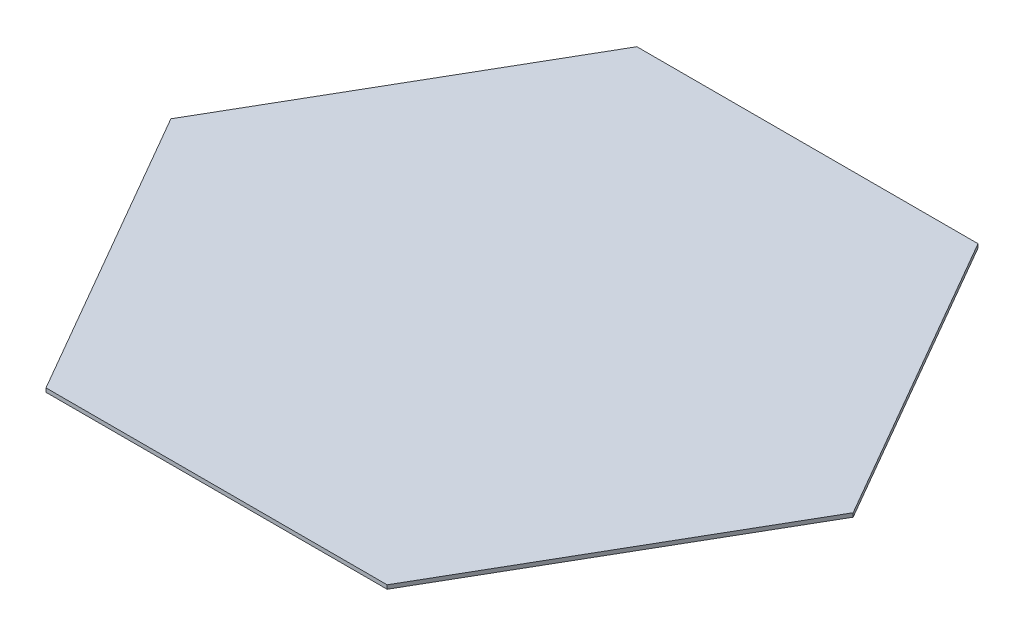
ISO-10303-21;
HEADER;
FILE_DESCRIPTION(('STEP AP214'),'2;1');
FILE_NAME('part.step','',(''),(''),'','','');
FILE_SCHEMA(('AUTOMOTIVE_DESIGN { 1 0 10303 214 1 1 1 1 }'));
ENDSEC;
DATA;
#1=APPLICATION_CONTEXT('core data for automotive mechanical design processes');
#2=APPLICATION_PROTOCOL_DEFINITION('international standard','automotive_design',2000,#1);
#3=PRODUCT_CONTEXT('',#1,'mechanical');
#4=PRODUCT('Part','Part','',(#3));
#5=PRODUCT_RELATED_PRODUCT_CATEGORY('part','',(#4));
#6=PRODUCT_DEFINITION_FORMATION('','',#4);
#7=PRODUCT_DEFINITION_CONTEXT('part definition',#1,'design');
#8=PRODUCT_DEFINITION('design','',#6,#7);
#9=PRODUCT_DEFINITION_SHAPE('','',#8);
#10=(LENGTH_UNIT() NAMED_UNIT(*) SI_UNIT(.MILLI.,.METRE.));
#11=(NAMED_UNIT(*) PLANE_ANGLE_UNIT() SI_UNIT($,.RADIAN.));
#12=(NAMED_UNIT(*) SI_UNIT($,.STERADIAN.) SOLID_ANGLE_UNIT());
#13=UNCERTAINTY_MEASURE_WITH_UNIT(LENGTH_MEASURE(1.E-05),#10,'distance_accuracy_value','');
#14=(GEOMETRIC_REPRESENTATION_CONTEXT(3) GLOBAL_UNCERTAINTY_ASSIGNED_CONTEXT((#13)) GLOBAL_UNIT_ASSIGNED_CONTEXT((#10,
#11,#12)) REPRESENTATION_CONTEXT('',''));
#15=CARTESIAN_POINT('',(0.,0.,0.));
#16=DIRECTION('',(0.,0.,1.));
#17=DIRECTION('',(1.,0.,0.));
#18=AXIS2_PLACEMENT_3D('',#15,#16,#17);
#19=CARTESIAN_POINT('',(440.,5.,0.));
#20=DIRECTION('',(-0.866025403784439,0.,0.5));
#21=DIRECTION('',(0.5,0.,0.866025403784439));
#22=AXIS2_PLACEMENT_3D('',#19,#20,#21);
#23=PLANE('',#22);
#24=DIRECTION('',(-0.5,0.,-0.866025403784439));
#25=VECTOR('',#24,1.);
#26=CARTESIAN_POINT('',(440.,0.,0.));
#27=LINE('',#26,#25);
#28=CARTESIAN_POINT('',(440.,0.,0.));
#29=VERTEX_POINT('',#28);
#30=CARTESIAN_POINT('',(220.,0.,-381.051177665153));
#31=VERTEX_POINT('',#30);
#32=EDGE_CURVE('E129',#29,#31,#27,.T.);
#33=ORIENTED_EDGE('',*,*,#32,.T.);
#34=DIRECTION('',(0.,-1.,0.));
#35=VECTOR('',#34,1.);
#36=CARTESIAN_POINT('',(220.,5.,-381.051177665153));
#37=LINE('',#36,#35);
#38=CARTESIAN_POINT('',(220.,5.,-381.051177665153));
#39=VERTEX_POINT('',#38);
#40=EDGE_CURVE('E11',#39,#31,#37,.T.);
#41=ORIENTED_EDGE('',*,*,#40,.F.);
#42=DIRECTION('',(-0.5,0.,-0.866025403784439));
#43=VECTOR('',#42,1.);
#44=CARTESIAN_POINT('',(440.,5.,0.));
#45=LINE('',#44,#43);
#46=CARTESIAN_POINT('',(440.,5.,0.));
#47=VERTEX_POINT('',#46);
#48=EDGE_CURVE('E145',#47,#39,#45,.T.);
#49=ORIENTED_EDGE('',*,*,#48,.F.);
#50=DIRECTION('',(0.,-1.,0.));
#51=VECTOR('',#50,1.);
#52=CARTESIAN_POINT('',(440.,5.,0.));
#53=LINE('',#52,#51);
#54=EDGE_CURVE('E125',#47,#29,#53,.T.);
#55=ORIENTED_EDGE('',*,*,#54,.T.);
#56=EDGE_LOOP('',(#33,#41,#49,#55));
#57=FACE_BOUND('',#56,.T.);
#58=ADVANCED_FACE('F39',(#57),#23,.F.);
#59=CARTESIAN_POINT('',(220.,5.,-381.051177665153));
#60=DIRECTION('',(0.,0.,1.));
#61=DIRECTION('',(1.,0.,0.));
#62=AXIS2_PLACEMENT_3D('',#59,#60,#61);
#63=PLANE('',#62);
#64=DIRECTION('',(-1.,0.,0.));
#65=VECTOR('',#64,1.);
#66=CARTESIAN_POINT('',(220.,0.,-381.051177665153));
#67=LINE('',#66,#65);
#68=CARTESIAN_POINT('',(-220.,0.,-381.051177665153));
#69=VERTEX_POINT('',#68);
#70=EDGE_CURVE('E133',#31,#69,#67,.T.);
#71=ORIENTED_EDGE('',*,*,#70,.T.);
#72=DIRECTION('',(0.,-1.,0.));
#73=VECTOR('',#72,1.);
#74=CARTESIAN_POINT('',(-220.,5.,-381.051177665153));
#75=LINE('',#74,#73);
#76=CARTESIAN_POINT('',(-220.,5.,-381.051177665153));
#77=VERTEX_POINT('',#76);
#78=EDGE_CURVE('E48',#77,#69,#75,.T.);
#79=ORIENTED_EDGE('',*,*,#78,.F.);
#80=DIRECTION('',(-1.,0.,0.));
#81=VECTOR('',#80,1.);
#82=CARTESIAN_POINT('',(220.,5.,-381.051177665153));
#83=LINE('',#82,#81);
#84=EDGE_CURVE('E93',#39,#77,#83,.T.);
#85=ORIENTED_EDGE('',*,*,#84,.F.);
#86=ORIENTED_EDGE('',*,*,#40,.T.);
#87=EDGE_LOOP('',(#71,#79,#85,#86));
#88=FACE_BOUND('',#87,.T.);
#89=ADVANCED_FACE('F174',(#88),#63,.F.);
#90=CARTESIAN_POINT('',(-220.,5.,-381.051177665153));
#91=DIRECTION('',(0.866025403784439,0.,0.5));
#92=DIRECTION('',(0.5,0.,-0.866025403784439));
#93=AXIS2_PLACEMENT_3D('',#90,#91,#92);
#94=PLANE('',#93);
#95=DIRECTION('',(-0.5,0.,0.866025403784439));
#96=VECTOR('',#95,1.);
#97=CARTESIAN_POINT('',(-220.,0.,-381.051177665153));
#98=LINE('',#97,#96);
#99=CARTESIAN_POINT('',(-440.,0.,0.));
#100=VERTEX_POINT('',#99);
#101=EDGE_CURVE('E136',#69,#100,#98,.T.);
#102=ORIENTED_EDGE('',*,*,#101,.T.);
#103=DIRECTION('',(0.,-1.,0.));
#104=VECTOR('',#103,1.);
#105=CARTESIAN_POINT('',(-440.,5.,0.));
#106=LINE('',#105,#104);
#107=CARTESIAN_POINT('',(-440.,5.,0.));
#108=VERTEX_POINT('',#107);
#109=EDGE_CURVE('E117',#108,#100,#106,.T.);
#110=ORIENTED_EDGE('',*,*,#109,.F.);
#111=DIRECTION('',(-0.5,0.,0.866025403784439));
#112=VECTOR('',#111,1.);
#113=CARTESIAN_POINT('',(-220.,5.,-381.051177665153));
#114=LINE('',#113,#112);
#115=EDGE_CURVE('E106',#77,#108,#114,.T.);
#116=ORIENTED_EDGE('',*,*,#115,.F.);
#117=ORIENTED_EDGE('',*,*,#78,.T.);
#118=EDGE_LOOP('',(#102,#110,#116,#117));
#119=FACE_BOUND('',#118,.T.);
#120=ADVANCED_FACE('F156',(#119),#94,.F.);
#121=CARTESIAN_POINT('',(-440.,5.,0.));
#122=DIRECTION('',(0.866025403784439,0.,-0.5));
#123=DIRECTION('',(-0.5,0.,-0.866025403784439));
#124=AXIS2_PLACEMENT_3D('',#121,#122,#123);
#125=PLANE('',#124);
#126=DIRECTION('',(0.5,0.,0.866025403784439));
#127=VECTOR('',#126,1.);
#128=CARTESIAN_POINT('',(-440.,0.,0.));
#129=LINE('',#128,#127);
#130=CARTESIAN_POINT('',(-220.,0.,381.051177665153));
#131=VERTEX_POINT('',#130);
#132=EDGE_CURVE('E115',#100,#131,#129,.T.);
#133=ORIENTED_EDGE('',*,*,#132,.T.);
#134=DIRECTION('',(0.,-1.,0.));
#135=VECTOR('',#134,1.);
#136=CARTESIAN_POINT('',(-220.,5.,381.051177665153));
#137=LINE('',#136,#135);
#138=CARTESIAN_POINT('',(-220.,5.,381.051177665153));
#139=VERTEX_POINT('',#138);
#140=EDGE_CURVE('E112',#139,#131,#137,.T.);
#141=ORIENTED_EDGE('',*,*,#140,.F.);
#142=DIRECTION('',(0.5,0.,0.866025403784439));
#143=VECTOR('',#142,1.);
#144=CARTESIAN_POINT('',(-440.,5.,0.));
#145=LINE('',#144,#143);
#146=EDGE_CURVE('E100',#108,#139,#145,.T.);
#147=ORIENTED_EDGE('',*,*,#146,.F.);
#148=ORIENTED_EDGE('',*,*,#109,.T.);
#149=EDGE_LOOP('',(#133,#141,#147,#148));
#150=FACE_BOUND('',#149,.T.);
#151=ADVANCED_FACE('F113',(#150),#125,.F.);
#152=CARTESIAN_POINT('',(-220.,5.,381.051177665153));
#153=DIRECTION('',(0.,0.,-1.));
#154=DIRECTION('',(-1.,0.,0.));
#155=AXIS2_PLACEMENT_3D('',#152,#153,#154);
#156=PLANE('',#155);
#157=DIRECTION('',(1.,0.,0.));
#158=VECTOR('',#157,1.);
#159=CARTESIAN_POINT('',(-220.,0.,381.051177665153));
#160=LINE('',#159,#158);
#161=CARTESIAN_POINT('',(220.,0.,381.051177665153));
#162=VERTEX_POINT('',#161);
#163=EDGE_CURVE('E79',#131,#162,#160,.T.);
#164=ORIENTED_EDGE('',*,*,#163,.T.);
#165=DIRECTION('',(0.,-1.,0.));
#166=VECTOR('',#165,1.);
#167=CARTESIAN_POINT('',(220.,5.,381.051177665153));
#168=LINE('',#167,#166);
#169=CARTESIAN_POINT('',(220.,5.,381.051177665153));
#170=VERTEX_POINT('',#169);
#171=EDGE_CURVE('E118',#170,#162,#168,.T.);
#172=ORIENTED_EDGE('',*,*,#171,.F.);
#173=DIRECTION('',(1.,0.,0.));
#174=VECTOR('',#173,1.);
#175=CARTESIAN_POINT('',(-220.,5.,381.051177665153));
#176=LINE('',#175,#174);
#177=EDGE_CURVE('E104',#139,#170,#176,.T.);
#178=ORIENTED_EDGE('',*,*,#177,.F.);
#179=ORIENTED_EDGE('',*,*,#140,.T.);
#180=EDGE_LOOP('',(#164,#172,#178,#179));
#181=FACE_BOUND('',#180,.T.);
#182=ADVANCED_FACE('F120',(#181),#156,.F.);
#183=CARTESIAN_POINT('',(220.,5.,381.051177665153));
#184=DIRECTION('',(-0.866025403784439,0.,-0.5));
#185=DIRECTION('',(-0.5,0.,0.866025403784439));
#186=AXIS2_PLACEMENT_3D('',#183,#184,#185);
#187=PLANE('',#186);
#188=DIRECTION('',(0.5,0.,-0.866025403784439));
#189=VECTOR('',#188,1.);
#190=CARTESIAN_POINT('',(220.,0.,381.051177665153));
#191=LINE('',#190,#189);
#192=EDGE_CURVE('E85',#162,#29,#191,.T.);
#193=ORIENTED_EDGE('',*,*,#192,.T.);
#194=ORIENTED_EDGE('',*,*,#54,.F.);
#195=DIRECTION('',(0.5,0.,-0.866025403784439));
#196=VECTOR('',#195,1.);
#197=CARTESIAN_POINT('',(220.,5.,381.051177665153));
#198=LINE('',#197,#196);
#199=EDGE_CURVE('E56',#170,#47,#198,.T.);
#200=ORIENTED_EDGE('',*,*,#199,.F.);
#201=ORIENTED_EDGE('',*,*,#171,.T.);
#202=EDGE_LOOP('',(#193,#194,#200,#201));
#203=FACE_BOUND('',#202,.T.);
#204=ADVANCED_FACE('F163',(#203),#187,.F.);
#205=CARTESIAN_POINT('',(0.,5.,0.));
#206=DIRECTION('',(0.,1.,0.));
#207=DIRECTION('',(0.,0.,1.));
#208=AXIS2_PLACEMENT_3D('',#205,#206,#207);
#209=PLANE('',#208);
#210=ORIENTED_EDGE('',*,*,#48,.T.);
#211=ORIENTED_EDGE('',*,*,#84,.T.);
#212=ORIENTED_EDGE('',*,*,#115,.T.);
#213=ORIENTED_EDGE('',*,*,#146,.T.);
#214=ORIENTED_EDGE('',*,*,#177,.T.);
#215=ORIENTED_EDGE('',*,*,#199,.T.);
#216=EDGE_LOOP('',(#210,#211,#212,#213,#214,#215));
#217=FACE_BOUND('',#216,.T.);
#218=ADVANCED_FACE('F102',(#217),#209,.T.);
#219=CARTESIAN_POINT('',(0.,0.,0.));
#220=DIRECTION('',(0.,1.,0.));
#221=DIRECTION('',(0.,0.,1.));
#222=AXIS2_PLACEMENT_3D('',#219,#220,#221);
#223=PLANE('',#222);
#224=ORIENTED_EDGE('',*,*,#32,.F.);
#225=ORIENTED_EDGE('',*,*,#192,.F.);
#226=ORIENTED_EDGE('',*,*,#163,.F.);
#227=ORIENTED_EDGE('',*,*,#132,.F.);
#228=ORIENTED_EDGE('',*,*,#101,.F.);
#229=ORIENTED_EDGE('',*,*,#70,.F.);
#230=EDGE_LOOP('',(#224,#225,#226,#227,#228,#229));
#231=FACE_BOUND('',#230,.T.);
#232=ADVANCED_FACE('F159',(#231),#223,.F.);
#233=CLOSED_SHELL('',(#58,#89,#120,#151,#182,#204,#218,#232));
#234=MANIFOLD_SOLID_BREP('B2',#233);
#235=ADVANCED_BREP_SHAPE_REPRESENTATION('',(#18,#234),#14);
#236=SHAPE_DEFINITION_REPRESENTATION(#9,#235);
ENDSEC;
END-ISO-10303-21;
